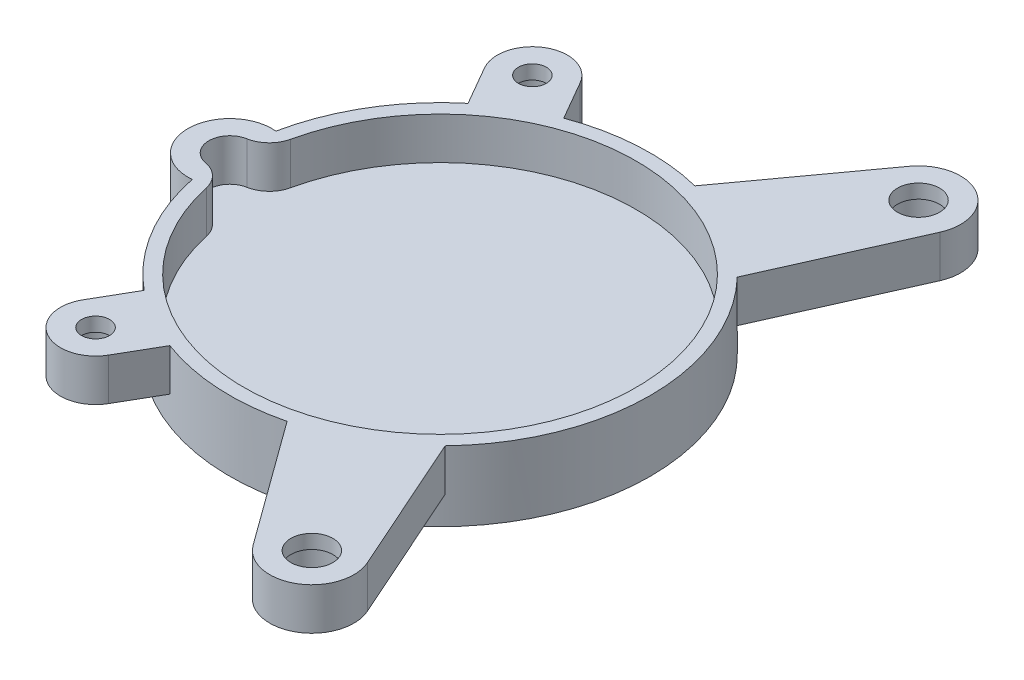
ISO-10303-21;
HEADER;
FILE_DESCRIPTION(('STEP AP214'),'2;1');
FILE_NAME('part.step','',(''),(''),'','','');
FILE_SCHEMA(('AUTOMOTIVE_DESIGN { 1 0 10303 214 1 1 1 1 }'));
ENDSEC;
DATA;
#1=APPLICATION_CONTEXT('core data for automotive mechanical design processes');
#2=APPLICATION_PROTOCOL_DEFINITION('international standard','automotive_design',2000,#1);
#3=PRODUCT_CONTEXT('',#1,'mechanical');
#4=PRODUCT('Part','Part','',(#3));
#5=PRODUCT_RELATED_PRODUCT_CATEGORY('part','',(#4));
#6=PRODUCT_DEFINITION_FORMATION('','',#4);
#7=PRODUCT_DEFINITION_CONTEXT('part definition',#1,'design');
#8=PRODUCT_DEFINITION('design','',#6,#7);
#9=PRODUCT_DEFINITION_SHAPE('','',#8);
#10=(LENGTH_UNIT() NAMED_UNIT(*) SI_UNIT(.MILLI.,.METRE.));
#11=(NAMED_UNIT(*) PLANE_ANGLE_UNIT() SI_UNIT($,.RADIAN.));
#12=(NAMED_UNIT(*) SI_UNIT($,.STERADIAN.) SOLID_ANGLE_UNIT());
#13=UNCERTAINTY_MEASURE_WITH_UNIT(LENGTH_MEASURE(1.E-05),#10,'distance_accuracy_value','');
#14=(GEOMETRIC_REPRESENTATION_CONTEXT(3) GLOBAL_UNCERTAINTY_ASSIGNED_CONTEXT((#13)) GLOBAL_UNIT_ASSIGNED_CONTEXT((#10,
#11,#12)) REPRESENTATION_CONTEXT('',''));
#15=CARTESIAN_POINT('',(0.,0.,0.));
#16=DIRECTION('',(0.,0.,1.));
#17=DIRECTION('',(1.,0.,0.));
#18=AXIS2_PLACEMENT_3D('',#15,#16,#17);
#19=CARTESIAN_POINT('',(0.,0.,0.));
#20=DIRECTION('',(0.,1.,0.));
#21=DIRECTION('',(0.,0.,1.));
#22=AXIS2_PLACEMENT_3D('',#19,#20,#21);
#23=PLANE('',#22);
#24=CARTESIAN_POINT('',(-9.00000000000008,0.,-15.5884572681198));
#25=DIRECTION('',(0.,1.,0.));
#26=DIRECTION('',(0.,0.,1.));
#27=AXIS2_PLACEMENT_3D('',#24,#25,#26);
#28=CIRCLE('',#27,1.);
#29=CARTESIAN_POINT('',(-9.00000000000008,0.,-14.5884572681198));
#30=VERTEX_POINT('',#29);
#31=EDGE_CURVE('E139',#30,#30,#28,.F.);
#32=ORIENTED_EDGE('',*,*,#31,.T.);
#33=EDGE_LOOP('',(#32));
#34=FACE_BOUND('',#33,.T.);
#35=CARTESIAN_POINT('',(-15.,0.,0.));
#36=DIRECTION('',(0.,1.,0.));
#37=DIRECTION('',(0.,0.,1.));
#38=AXIS2_PLACEMENT_3D('',#35,#36,#37);
#39=CIRCLE('',#38,1.5);
#40=CARTESIAN_POINT('',(-15.2678571428571,0.,-1.47589042649528));
#41=VERTEX_POINT('',#40);
#42=CARTESIAN_POINT('',(-15.2678571428571,0.,1.47589042649528));
#43=VERTEX_POINT('',#42);
#44=EDGE_CURVE('E11',#41,#43,#39,.T.);
#45=ORIENTED_EDGE('',*,*,#44,.F.);
#46=CARTESIAN_POINT('',(-15.625,0.,-3.44374432848898));
#47=DIRECTION('',(0.,1.,0.));
#48=DIRECTION('',(0.,0.,1.));
#49=AXIS2_PLACEMENT_3D('',#46,#47,#48);
#50=CIRCLE('',#49,2.);
#51=CARTESIAN_POINT('',(-13.671875,0.,-3.01327628742785));
#52=VERTEX_POINT('',#51);
#53=EDGE_CURVE('E45',#41,#52,#50,.T.);
#54=ORIENTED_EDGE('',*,*,#53,.T.);
#55=CARTESIAN_POINT('',(0.,0.,0.));
#56=DIRECTION('',(0.,1.,0.));
#57=DIRECTION('',(0.,0.,1.));
#58=AXIS2_PLACEMENT_3D('',#55,#56,#57);
#59=CIRCLE('',#58,14.);
#60=CARTESIAN_POINT('',(-13.671875,0.,3.01327628742786));
#61=VERTEX_POINT('',#60);
#62=EDGE_CURVE('E95',#61,#52,#59,.T.);
#63=ORIENTED_EDGE('',*,*,#62,.F.);
#64=CARTESIAN_POINT('',(-15.625,0.,3.44374432848898));
#65=DIRECTION('',(0.,1.,0.));
#66=DIRECTION('',(0.,0.,1.));
#67=AXIS2_PLACEMENT_3D('',#64,#65,#66);
#68=CIRCLE('',#67,2.);
#69=EDGE_CURVE('E51',#43,#61,#68,.F.);
#70=ORIENTED_EDGE('',*,*,#69,.F.);
#71=EDGE_LOOP('',(#45,#54,#63,#70));
#72=FACE_BOUND('',#71,.T.);
#73=CARTESIAN_POINT('',(-15.,0.,0.));
#74=DIRECTION('',(0.,1.,0.));
#75=DIRECTION('',(0.,0.,1.));
#76=AXIS2_PLACEMENT_3D('',#73,#74,#75);
#77=CIRCLE('',#76,3.);
#78=CARTESIAN_POINT('',(-14.7,0.,2.98496231131986));
#79=VERTEX_POINT('',#78);
#80=CARTESIAN_POINT('',(-14.7,0.,-2.98496231131986));
#81=VERTEX_POINT('',#80);
#82=EDGE_CURVE('E125',#79,#81,#77,.F.);
#83=ORIENTED_EDGE('',*,*,#82,.F.);
#84=CARTESIAN_POINT('',(0.,0.,0.));
#85=DIRECTION('',(0.,1.,0.));
#86=DIRECTION('',(0.,0.,1.));
#87=AXIS2_PLACEMENT_3D('',#84,#85,#86);
#88=CIRCLE('',#87,15.);
#89=CARTESIAN_POINT('',(-9.56016323833567,0.,11.5586884574495));
#90=VERTEX_POINT('',#89);
#91=EDGE_CURVE('E129',#90,#79,#88,.F.);
#92=ORIENTED_EDGE('',*,*,#91,.F.);
#93=DIRECTION('',(-0.500000000000004,0.,0.866025403784436));
#94=VECTOR('',#93,1.);
#95=CARTESIAN_POINT('',(-2.16506350946109,0.,-1.25000000000001));
#96=LINE('',#95,#94);
#97=CARTESIAN_POINT('',(-11.1650635094612,0.,14.3384572681198));
#98=VERTEX_POINT('',#97);
#99=EDGE_CURVE('E151',#90,#98,#96,.T.);
#100=ORIENTED_EDGE('',*,*,#99,.T.);
#101=CARTESIAN_POINT('',(-9.00000000000008,0.,15.5884572681198));
#102=DIRECTION('',(0.,1.,0.));
#103=DIRECTION('',(0.,0.,1.));
#104=AXIS2_PLACEMENT_3D('',#101,#102,#103);
#105=CIRCLE('',#104,2.5);
#106=CARTESIAN_POINT('',(-6.83493649053898,0.,16.8384572681199));
#107=VERTEX_POINT('',#106);
#108=EDGE_CURVE('E154',#98,#107,#105,.T.);
#109=ORIENTED_EDGE('',*,*,#108,.T.);
#110=DIRECTION('',(-0.500000000000004,0.,0.866025403784436));
#111=VECTOR('',#110,1.);
#112=CARTESIAN_POINT('',(2.16506350946109,0.,1.25000000000001));
#113=LINE('',#112,#111);
#114=CARTESIAN_POINT('',(-5.23003621941349,0.,14.0586884574495));
#115=VERTEX_POINT('',#114);
#116=EDGE_CURVE('E110',#115,#107,#113,.T.);
#117=ORIENTED_EDGE('',*,*,#116,.F.);
#118=CARTESIAN_POINT('',(3.63498864822928,0.,14.5528985953742));
#119=VERTEX_POINT('',#118);
#120=EDGE_CURVE('E128',#119,#115,#88,.F.);
#121=ORIENTED_EDGE('',*,*,#120,.F.);
#122=DIRECTION('',(0.587785252292465,0.,0.809016994374953));
#123=VECTOR('',#122,1.);
#124=CARTESIAN_POINT('',(-4.54118356261046,0.,3.29936298571533));
#125=LINE('',#124,#123);
#126=CARTESIAN_POINT('',(10.0729490168751,0.,23.4139908514884));
#127=VERTEX_POINT('',#126);
#128=EDGE_CURVE('E160',#119,#127,#125,.T.);
#129=ORIENTED_EDGE('',*,*,#128,.T.);
#130=CARTESIAN_POINT('',(12.4999999999999,0.,21.650635094611));
#131=DIRECTION('',(0.,1.,0.));
#132=DIRECTION('',(0.,0.,1.));
#133=AXIS2_PLACEMENT_3D('',#130,#131,#132);
#134=CIRCLE('',#133,3.);
#135=CARTESIAN_POINT('',(15.2406363729277,0.,20.4304251653836));
#136=VERTEX_POINT('',#135);
#137=EDGE_CURVE('E157',#127,#136,#134,.T.);
#138=ORIENTED_EDGE('',*,*,#137,.T.);
#139=DIRECTION('',(0.406736643075804,0.,0.913545457642599));
#140=VECTOR('',#139,1.);
#141=CARTESIAN_POINT('',(5.12792394324079,0.,-2.28309883561129));
#142=LINE('',#141,#140);
#143=CARTESIAN_POINT('',(10.7856855581782,0.,10.4244418095218));
#144=VERTEX_POINT('',#143);
#145=EDGE_CURVE('E106',#144,#136,#142,.T.);
#146=ORIENTED_EDGE('',*,*,#145,.F.);
#147=CARTESIAN_POINT('',(10.7856855581782,0.,-10.4244418095218));
#148=VERTEX_POINT('',#147);
#149=EDGE_CURVE('E841',#148,#144,#88,.F.);
#150=ORIENTED_EDGE('',*,*,#149,.F.);
#151=DIRECTION('',(0.406736643075804,0.,-0.913545457642599));
#152=VECTOR('',#151,1.);
#153=CARTESIAN_POINT('',(5.12792394324079,0.,2.28309883561129));
#154=LINE('',#153,#152);
#155=CARTESIAN_POINT('',(15.2406363729277,0.,-20.4304251653836));
#156=VERTEX_POINT('',#155);
#157=EDGE_CURVE('E148',#148,#156,#154,.T.);
#158=ORIENTED_EDGE('',*,*,#157,.T.);
#159=CARTESIAN_POINT('',(12.4999999999999,0.,-21.650635094611));
#160=DIRECTION('',(0.,1.,0.));
#161=DIRECTION('',(0.,0.,1.));
#162=AXIS2_PLACEMENT_3D('',#159,#160,#161);
#163=CIRCLE('',#162,3.);
#164=CARTESIAN_POINT('',(10.0729490168751,0.,-23.4139908514884));
#165=VERTEX_POINT('',#164);
#166=EDGE_CURVE('E116',#165,#156,#163,.F.);
#167=ORIENTED_EDGE('',*,*,#166,.F.);
#168=DIRECTION('',(0.587785252292465,0.,-0.809016994374953));
#169=VECTOR('',#168,1.);
#170=CARTESIAN_POINT('',(-4.54118356261046,0.,-3.29936298571533));
#171=LINE('',#170,#169);
#172=CARTESIAN_POINT('',(3.63498864822928,0.,-14.5528985953742));
#173=VERTEX_POINT('',#172);
#174=EDGE_CURVE('E113',#173,#165,#171,.T.);
#175=ORIENTED_EDGE('',*,*,#174,.F.);
#176=CARTESIAN_POINT('',(-5.23003621941349,0.,-14.0586884574495));
#177=VERTEX_POINT('',#176);
#178=EDGE_CURVE('E839',#177,#173,#88,.F.);
#179=ORIENTED_EDGE('',*,*,#178,.F.);
#180=DIRECTION('',(-0.500000000000004,0.,-0.866025403784436));
#181=VECTOR('',#180,1.);
#182=CARTESIAN_POINT('',(2.16506350946109,0.,-1.25000000000001));
#183=LINE('',#182,#181);
#184=CARTESIAN_POINT('',(-6.83493649053898,0.,-16.8384572681199));
#185=VERTEX_POINT('',#184);
#186=EDGE_CURVE('E145',#177,#185,#183,.T.);
#187=ORIENTED_EDGE('',*,*,#186,.T.);
#188=CARTESIAN_POINT('',(-9.00000000000008,0.,-15.5884572681198));
#189=DIRECTION('',(0.,1.,0.));
#190=DIRECTION('',(0.,0.,1.));
#191=AXIS2_PLACEMENT_3D('',#188,#189,#190);
#192=CIRCLE('',#191,2.5);
#193=CARTESIAN_POINT('',(-11.1650635094612,0.,-14.3384572681198));
#194=VERTEX_POINT('',#193);
#195=EDGE_CURVE('E119',#194,#185,#192,.F.);
#196=ORIENTED_EDGE('',*,*,#195,.F.);
#197=DIRECTION('',(-0.500000000000004,0.,-0.866025403784436));
#198=VECTOR('',#197,1.);
#199=CARTESIAN_POINT('',(-2.16506350946109,0.,1.25000000000001));
#200=LINE('',#199,#198);
#201=CARTESIAN_POINT('',(-9.56016323833567,0.,-11.5586884574495));
#202=VERTEX_POINT('',#201);
#203=EDGE_CURVE('E122',#202,#194,#200,.T.);
#204=ORIENTED_EDGE('',*,*,#203,.F.);
#205=EDGE_CURVE('E132',#81,#202,#88,.F.);
#206=ORIENTED_EDGE('',*,*,#205,.F.);
#207=EDGE_LOOP('',(#83,#92,#100,#109,#117,#121,#129,#138,#146,#150,#158,#167,#175,#179,#187,
#196,#204,#206));
#208=FACE_BOUND('',#207,.T.);
#209=CARTESIAN_POINT('',(12.4999999999999,0.,-21.650635094611));
#210=DIRECTION('',(0.,1.,0.));
#211=DIRECTION('',(0.,0.,1.));
#212=AXIS2_PLACEMENT_3D('',#209,#210,#211);
#213=CIRCLE('',#212,1.5);
#214=CARTESIAN_POINT('',(12.4999999999999,0.,-20.150635094611));
#215=VERTEX_POINT('',#214);
#216=EDGE_CURVE('E142',#215,#215,#213,.F.);
#217=ORIENTED_EDGE('',*,*,#216,.T.);
#218=EDGE_LOOP('',(#217));
#219=FACE_BOUND('',#218,.T.);
#220=CARTESIAN_POINT('',(12.4999999999999,0.,21.650635094611));
#221=DIRECTION('',(0.,1.,0.));
#222=DIRECTION('',(0.,0.,1.));
#223=AXIS2_PLACEMENT_3D('',#220,#221,#222);
#224=CIRCLE('',#223,1.5);
#225=CARTESIAN_POINT('',(12.4999999999999,0.,23.150635094611));
#226=VERTEX_POINT('',#225);
#227=EDGE_CURVE('E133',#226,#226,#224,.T.);
#228=ORIENTED_EDGE('',*,*,#227,.F.);
#229=EDGE_LOOP('',(#228));
#230=FACE_BOUND('',#229,.T.);
#231=CARTESIAN_POINT('',(-9.00000000000008,0.,15.5884572681198));
#232=DIRECTION('',(0.,1.,0.));
#233=DIRECTION('',(0.,0.,1.));
#234=AXIS2_PLACEMENT_3D('',#231,#232,#233);
#235=CIRCLE('',#234,1.);
#236=CARTESIAN_POINT('',(-9.00000000000008,0.,16.5884572681198));
#237=VERTEX_POINT('',#236);
#238=EDGE_CURVE('E136',#237,#237,#235,.T.);
#239=ORIENTED_EDGE('',*,*,#238,.F.);
#240=EDGE_LOOP('',(#239));
#241=FACE_BOUND('',#240,.T.);
#242=ADVANCED_FACE('F41',(#34,#72,#208,#219,#230,#241),#23,.T.);
#243=CARTESIAN_POINT('',(0.,-3.,0.));
#244=DIRECTION('',(0.,1.,0.));
#245=DIRECTION('',(0.,0.,1.));
#246=AXIS2_PLACEMENT_3D('',#243,#244,#245);
#247=CYLINDRICAL_SURFACE('',#246,14.);
#248=ORIENTED_EDGE('',*,*,#62,.T.);
#249=DIRECTION('',(0.,1.,0.));
#250=VECTOR('',#249,1.);
#251=CARTESIAN_POINT('',(-13.671875,-3.,-3.01327628742785));
#252=LINE('',#251,#250);
#253=CARTESIAN_POINT('',(-13.671875,-3.,-3.01327628742785));
#254=VERTEX_POINT('',#253);
#255=EDGE_CURVE('E251',#254,#52,#252,.T.);
#256=ORIENTED_EDGE('',*,*,#255,.F.);
#257=CARTESIAN_POINT('',(0.,-3.,0.));
#258=DIRECTION('',(0.,1.,0.));
#259=DIRECTION('',(0.,0.,1.));
#260=AXIS2_PLACEMENT_3D('',#257,#258,#259);
#261=CIRCLE('',#260,14.);
#262=CARTESIAN_POINT('',(-13.671875,-3.,3.01327628742786));
#263=VERTEX_POINT('',#262);
#264=EDGE_CURVE('E86',#263,#254,#261,.T.);
#265=ORIENTED_EDGE('',*,*,#264,.F.);
#266=DIRECTION('',(0.,1.,0.));
#267=VECTOR('',#266,1.);
#268=CARTESIAN_POINT('',(-13.671875,-3.,3.01327628742786));
#269=LINE('',#268,#267);
#270=EDGE_CURVE('E257',#263,#61,#269,.T.);
#271=ORIENTED_EDGE('',*,*,#270,.T.);
#272=EDGE_LOOP('',(#248,#256,#265,#271));
#273=FACE_BOUND('',#272,.T.);
#274=ADVANCED_FACE('F265',(#273),#247,.F.);
#275=CARTESIAN_POINT('',(-15.625,-3.,-3.44374432848898));
#276=DIRECTION('',(0.,1.,0.));
#277=DIRECTION('',(0.,0.,1.));
#278=AXIS2_PLACEMENT_3D('',#275,#276,#277);
#279=CYLINDRICAL_SURFACE('',#278,2.);
#280=ORIENTED_EDGE('',*,*,#53,.F.);
#281=DIRECTION('',(0.,1.,0.));
#282=VECTOR('',#281,1.);
#283=CARTESIAN_POINT('',(-15.2678571428571,-3.,-1.47589042649528));
#284=LINE('',#283,#282);
#285=CARTESIAN_POINT('',(-15.2678571428571,-3.,-1.47589042649528));
#286=VERTEX_POINT('',#285);
#287=EDGE_CURVE('E78',#286,#41,#284,.T.);
#288=ORIENTED_EDGE('',*,*,#287,.F.);
#289=CARTESIAN_POINT('',(-15.625,-3.,-3.44374432848898));
#290=DIRECTION('',(0.,1.,0.));
#291=DIRECTION('',(0.,0.,1.));
#292=AXIS2_PLACEMENT_3D('',#289,#290,#291);
#293=CIRCLE('',#292,2.);
#294=EDGE_CURVE('E82',#286,#254,#293,.T.);
#295=ORIENTED_EDGE('',*,*,#294,.T.);
#296=ORIENTED_EDGE('',*,*,#255,.T.);
#297=EDGE_LOOP('',(#280,#288,#295,#296));
#298=FACE_BOUND('',#297,.T.);
#299=ADVANCED_FACE('F80',(#298),#279,.T.);
#300=CARTESIAN_POINT('',(0.,-3.,0.));
#301=DIRECTION('',(0.,1.,0.));
#302=DIRECTION('',(0.,0.,1.));
#303=AXIS2_PLACEMENT_3D('',#300,#301,#302);
#304=PLANE('',#303);
#305=ORIENTED_EDGE('',*,*,#294,.F.);
#306=CARTESIAN_POINT('',(-15.,-3.,0.));
#307=DIRECTION('',(0.,1.,0.));
#308=DIRECTION('',(0.,0.,1.));
#309=AXIS2_PLACEMENT_3D('',#306,#307,#308);
#310=CIRCLE('',#309,1.5);
#311=CARTESIAN_POINT('',(-15.2678571428571,-3.,1.47589042649528));
#312=VERTEX_POINT('',#311);
#313=EDGE_CURVE('E93',#286,#312,#310,.T.);
#314=ORIENTED_EDGE('',*,*,#313,.T.);
#315=CARTESIAN_POINT('',(-15.625,-3.,3.44374432848898));
#316=DIRECTION('',(0.,1.,0.));
#317=DIRECTION('',(0.,0.,1.));
#318=AXIS2_PLACEMENT_3D('',#315,#316,#317);
#319=CIRCLE('',#318,2.);
#320=EDGE_CURVE('E98',#312,#263,#319,.F.);
#321=ORIENTED_EDGE('',*,*,#320,.T.);
#322=ORIENTED_EDGE('',*,*,#264,.T.);
#323=EDGE_LOOP('',(#305,#314,#321,#322));
#324=FACE_BOUND('',#323,.T.);
#325=ADVANCED_FACE('F91',(#324),#304,.T.);
#326=CARTESIAN_POINT('',(-15.625,-3.,3.44374432848898));
#327=DIRECTION('',(0.,1.,0.));
#328=DIRECTION('',(0.,0.,1.));
#329=AXIS2_PLACEMENT_3D('',#326,#327,#328);
#330=CYLINDRICAL_SURFACE('',#329,2.);
#331=ORIENTED_EDGE('',*,*,#69,.T.);
#332=ORIENTED_EDGE('',*,*,#270,.F.);
#333=ORIENTED_EDGE('',*,*,#320,.F.);
#334=DIRECTION('',(0.,1.,0.));
#335=VECTOR('',#334,1.);
#336=CARTESIAN_POINT('',(-15.2678571428571,-3.,1.47589042649528));
#337=LINE('',#336,#335);
#338=EDGE_CURVE('E73',#312,#43,#337,.T.);
#339=ORIENTED_EDGE('',*,*,#338,.T.);
#340=EDGE_LOOP('',(#331,#332,#333,#339));
#341=FACE_BOUND('',#340,.T.);
#342=ADVANCED_FACE('F459',(#341),#330,.T.);
#343=CARTESIAN_POINT('',(-15.,-3.,0.));
#344=DIRECTION('',(0.,1.,0.));
#345=DIRECTION('',(0.,0.,1.));
#346=AXIS2_PLACEMENT_3D('',#343,#344,#345);
#347=CYLINDRICAL_SURFACE('',#346,1.5);
#348=ORIENTED_EDGE('',*,*,#44,.T.);
#349=ORIENTED_EDGE('',*,*,#338,.F.);
#350=ORIENTED_EDGE('',*,*,#313,.F.);
#351=ORIENTED_EDGE('',*,*,#287,.T.);
#352=EDGE_LOOP('',(#348,#349,#350,#351));
#353=FACE_BOUND('',#352,.T.);
#354=ADVANCED_FACE('F97',(#353),#347,.F.);
#355=CARTESIAN_POINT('',(-9.00000000000008,-3.,15.5884572681198));
#356=DIRECTION('',(0.,1.,0.));
#357=DIRECTION('',(0.,0.,1.));
#358=AXIS2_PLACEMENT_3D('',#355,#356,#357);
#359=CYLINDRICAL_SURFACE('',#358,1.);
#360=CARTESIAN_POINT('',(-9.00000000000008,-1.,15.5884572681198));
#361=DIRECTION('',(0.,-1.,0.));
#362=DIRECTION('',(0.,0.,-1.));
#363=AXIS2_PLACEMENT_3D('',#360,#361,#362);
#364=CIRCLE('',#363,1.);
#365=CARTESIAN_POINT('',(-9.00000000000008,-1.,14.5884572681198));
#366=VERTEX_POINT('',#365);
#367=EDGE_CURVE('E247',#366,#366,#364,.T.);
#368=ORIENTED_EDGE('',*,*,#367,.T.);
#369=EDGE_LOOP('',(#368));
#370=FACE_BOUND('',#369,.T.);
#371=ORIENTED_EDGE('',*,*,#238,.T.);
#372=EDGE_LOOP('',(#371));
#373=FACE_BOUND('',#372,.T.);
#374=ADVANCED_FACE('F43',(#370,#373),#359,.F.);
#375=CARTESIAN_POINT('',(12.4999999999999,-3.,21.650635094611));
#376=DIRECTION('',(0.,1.,0.));
#377=DIRECTION('',(0.,0.,1.));
#378=AXIS2_PLACEMENT_3D('',#375,#376,#377);
#379=CYLINDRICAL_SURFACE('',#378,1.5);
#380=CARTESIAN_POINT('',(12.4999999999999,-1.,21.650635094611));
#381=DIRECTION('',(0.,-1.,0.));
#382=DIRECTION('',(0.,0.,-1.));
#383=AXIS2_PLACEMENT_3D('',#380,#381,#382);
#384=CIRCLE('',#383,1.5);
#385=CARTESIAN_POINT('',(12.4999999999999,-1.,20.150635094611));
#386=VERTEX_POINT('',#385);
#387=EDGE_CURVE('E523',#386,#386,#384,.T.);
#388=ORIENTED_EDGE('',*,*,#387,.T.);
#389=EDGE_LOOP('',(#388));
#390=FACE_BOUND('',#389,.T.);
#391=ORIENTED_EDGE('',*,*,#227,.T.);
#392=EDGE_LOOP('',(#391));
#393=FACE_BOUND('',#392,.T.);
#394=ADVANCED_FACE('F466',(#390,#393),#379,.F.);
#395=CARTESIAN_POINT('',(0.,2.,0.));
#396=DIRECTION('',(0.,-1.,0.));
#397=DIRECTION('',(0.,0.,-1.));
#398=AXIS2_PLACEMENT_3D('',#395,#396,#397);
#399=CYLINDRICAL_SURFACE('',#398,15.);
#400=DIRECTION('',(0.,-1.,0.));
#401=VECTOR('',#400,1.);
#402=CARTESIAN_POINT('',(-9.56016323833567,2.,11.5586884574495));
#403=LINE('',#402,#401);
#404=CARTESIAN_POINT('',(-9.56016323833567,-3.,11.5586884574494));
#405=VERTEX_POINT('',#404);
#406=EDGE_CURVE('E201',#405,#90,#403,.F.);
#407=ORIENTED_EDGE('',*,*,#406,.T.);
#408=ORIENTED_EDGE('',*,*,#91,.T.);
#409=DIRECTION('',(0.,-1.,0.));
#410=VECTOR('',#409,1.);
#411=CARTESIAN_POINT('',(-14.7,2.,2.98496231131986));
#412=LINE('',#411,#410);
#413=CARTESIAN_POINT('',(-14.7,-5.,2.98496231131986));
#414=VERTEX_POINT('',#413);
#415=EDGE_CURVE('E178',#79,#414,#412,.T.);
#416=ORIENTED_EDGE('',*,*,#415,.T.);
#417=CARTESIAN_POINT('',(0.,-5.,0.));
#418=DIRECTION('',(0.,-1.,0.));
#419=DIRECTION('',(0.,0.,-1.));
#420=AXIS2_PLACEMENT_3D('',#417,#418,#419);
#421=CIRCLE('',#420,15.);
#422=CARTESIAN_POINT('',(-14.7,-5.,-2.98496231131986));
#423=VERTEX_POINT('',#422);
#424=EDGE_CURVE('E184',#423,#414,#421,.T.);
#425=ORIENTED_EDGE('',*,*,#424,.F.);
#426=DIRECTION('',(0.,-1.,0.));
#427=VECTOR('',#426,1.);
#428=CARTESIAN_POINT('',(-14.7,2.,-2.98496231131986));
#429=LINE('',#428,#427);
#430=EDGE_CURVE('E181',#81,#423,#429,.T.);
#431=ORIENTED_EDGE('',*,*,#430,.F.);
#432=ORIENTED_EDGE('',*,*,#205,.T.);
#433=DIRECTION('',(0.,-1.,0.));
#434=VECTOR('',#433,1.);
#435=CARTESIAN_POINT('',(-9.56016323833567,2.,-11.5586884574495));
#436=LINE('',#435,#434);
#437=CARTESIAN_POINT('',(-9.56016323833567,-3.,-11.5586884574494));
#438=VERTEX_POINT('',#437);
#439=EDGE_CURVE('E171',#438,#202,#436,.F.);
#440=ORIENTED_EDGE('',*,*,#439,.F.);
#441=CARTESIAN_POINT('',(0.,-3.,0.));
#442=DIRECTION('',(0.,1.,0.));
#443=DIRECTION('',(0.,0.,1.));
#444=AXIS2_PLACEMENT_3D('',#441,#442,#443);
#445=CIRCLE('',#444,15.);
#446=CARTESIAN_POINT('',(-5.23003621941349,-3.,-14.0586884574495));
#447=VERTEX_POINT('',#446);
#448=EDGE_CURVE('E177',#438,#447,#445,.F.);
#449=ORIENTED_EDGE('',*,*,#448,.T.);
#450=DIRECTION('',(0.,-1.,0.));
#451=VECTOR('',#450,1.);
#452=CARTESIAN_POINT('',(-5.23003621941349,2.,-14.0586884574495));
#453=LINE('',#452,#451);
#454=EDGE_CURVE('E174',#447,#177,#453,.F.);
#455=ORIENTED_EDGE('',*,*,#454,.T.);
#456=ORIENTED_EDGE('',*,*,#178,.T.);
#457=DIRECTION('',(0.,-1.,0.));
#458=VECTOR('',#457,1.);
#459=CARTESIAN_POINT('',(3.63498864822928,2.,-14.5528985953742));
#460=LINE('',#459,#458);
#461=CARTESIAN_POINT('',(3.63498864822928,-3.,-14.5528985953742));
#462=VERTEX_POINT('',#461);
#463=EDGE_CURVE('E166',#462,#173,#460,.F.);
#464=ORIENTED_EDGE('',*,*,#463,.F.);
#465=CARTESIAN_POINT('',(0.,-3.,0.));
#466=DIRECTION('',(0.,1.,0.));
#467=DIRECTION('',(0.,0.,1.));
#468=AXIS2_PLACEMENT_3D('',#465,#466,#467);
#469=CIRCLE('',#468,15.);
#470=CARTESIAN_POINT('',(10.7856855581782,-3.,-10.4244418095218));
#471=VERTEX_POINT('',#470);
#472=EDGE_CURVE('E170',#462,#471,#469,.F.);
#473=ORIENTED_EDGE('',*,*,#472,.T.);
#474=DIRECTION('',(0.,-1.,0.));
#475=VECTOR('',#474,1.);
#476=CARTESIAN_POINT('',(10.7856855581782,2.,-10.4244418095218));
#477=LINE('',#476,#475);
#478=EDGE_CURVE('E163',#471,#148,#477,.F.);
#479=ORIENTED_EDGE('',*,*,#478,.T.);
#480=ORIENTED_EDGE('',*,*,#149,.T.);
#481=DIRECTION('',(0.,-1.,0.));
#482=VECTOR('',#481,1.);
#483=CARTESIAN_POINT('',(10.7856855581782,2.,10.4244418095218));
#484=LINE('',#483,#482);
#485=CARTESIAN_POINT('',(10.7856855581782,-3.,10.4244418095218));
#486=VERTEX_POINT('',#485);
#487=EDGE_CURVE('E218',#486,#144,#484,.F.);
#488=ORIENTED_EDGE('',*,*,#487,.F.);
#489=CARTESIAN_POINT('',(0.,-3.,0.));
#490=DIRECTION('',(0.,1.,0.));
#491=DIRECTION('',(0.,0.,1.));
#492=AXIS2_PLACEMENT_3D('',#489,#490,#491);
#493=CIRCLE('',#492,15.);
#494=CARTESIAN_POINT('',(3.63498864822928,-3.,14.5528985953742));
#495=VERTEX_POINT('',#494);
#496=EDGE_CURVE('E109',#486,#495,#493,.F.);
#497=ORIENTED_EDGE('',*,*,#496,.T.);
#498=DIRECTION('',(0.,-1.,0.));
#499=VECTOR('',#498,1.);
#500=CARTESIAN_POINT('',(3.63498864822928,2.,14.5528985953742));
#501=LINE('',#500,#499);
#502=EDGE_CURVE('E215',#495,#119,#501,.F.);
#503=ORIENTED_EDGE('',*,*,#502,.T.);
#504=ORIENTED_EDGE('',*,*,#120,.T.);
#505=DIRECTION('',(0.,-1.,0.));
#506=VECTOR('',#505,1.);
#507=CARTESIAN_POINT('',(-5.23003621941349,2.,14.0586884574495));
#508=LINE('',#507,#506);
#509=CARTESIAN_POINT('',(-5.23003621941349,-3.,14.0586884574495));
#510=VERTEX_POINT('',#509);
#511=EDGE_CURVE('E204',#510,#115,#508,.F.);
#512=ORIENTED_EDGE('',*,*,#511,.F.);
#513=CARTESIAN_POINT('',(0.,-3.,0.));
#514=DIRECTION('',(0.,1.,0.));
#515=DIRECTION('',(0.,0.,1.));
#516=AXIS2_PLACEMENT_3D('',#513,#514,#515);
#517=CIRCLE('',#516,15.);
#518=EDGE_CURVE('E167',#510,#405,#517,.F.);
#519=ORIENTED_EDGE('',*,*,#518,.T.);
#520=EDGE_LOOP('',(#407,#408,#416,#425,#431,#432,#440,#449,#455,#456,#464,#473,#479,#480,#488,
#497,#503,#504,#512,#519));
#521=FACE_BOUND('',#520,.T.);
#522=ADVANCED_FACE('F422',(#521),#399,.T.);
#523=CARTESIAN_POINT('',(-9.00000000000008,-3.,-15.5884572681198));
#524=DIRECTION('',(0.,1.,0.));
#525=DIRECTION('',(0.,0.,1.));
#526=AXIS2_PLACEMENT_3D('',#523,#524,#525);
#527=CYLINDRICAL_SURFACE('',#526,1.);
#528=CARTESIAN_POINT('',(-9.00000000000008,-1.,-15.5884572681198));
#529=DIRECTION('',(0.,-1.,0.));
#530=DIRECTION('',(0.,0.,-1.));
#531=AXIS2_PLACEMENT_3D('',#528,#529,#530);
#532=CIRCLE('',#531,1.);
#533=CARTESIAN_POINT('',(-9.00000000000008,-1.,-16.5884572681198));
#534=VERTEX_POINT('',#533);
#535=EDGE_CURVE('E369',#534,#534,#532,.F.);
#536=ORIENTED_EDGE('',*,*,#535,.F.);
#537=EDGE_LOOP('',(#536));
#538=FACE_BOUND('',#537,.T.);
#539=ORIENTED_EDGE('',*,*,#31,.F.);
#540=EDGE_LOOP('',(#539));
#541=FACE_BOUND('',#540,.T.);
#542=ADVANCED_FACE('F465',(#538,#541),#527,.F.);
#543=CARTESIAN_POINT('',(12.4999999999999,-3.,-21.650635094611));
#544=DIRECTION('',(0.,1.,0.));
#545=DIRECTION('',(0.,0.,1.));
#546=AXIS2_PLACEMENT_3D('',#543,#544,#545);
#547=CYLINDRICAL_SURFACE('',#546,1.5);
#548=CARTESIAN_POINT('',(12.4999999999999,-1.,-21.650635094611));
#549=DIRECTION('',(0.,-1.,0.));
#550=DIRECTION('',(0.,0.,-1.));
#551=AXIS2_PLACEMENT_3D('',#548,#549,#550);
#552=CIRCLE('',#551,1.5);
#553=CARTESIAN_POINT('',(12.4999999999999,-1.,-23.150635094611));
#554=VERTEX_POINT('',#553);
#555=EDGE_CURVE('E376',#554,#554,#552,.F.);
#556=ORIENTED_EDGE('',*,*,#555,.F.);
#557=EDGE_LOOP('',(#556));
#558=FACE_BOUND('',#557,.T.);
#559=ORIENTED_EDGE('',*,*,#216,.F.);
#560=EDGE_LOOP('',(#559));
#561=FACE_BOUND('',#560,.T.);
#562=ADVANCED_FACE('F508',(#558,#561),#547,.F.);
#563=CARTESIAN_POINT('',(-15.,2.,0.));
#564=DIRECTION('',(0.,-1.,0.));
#565=DIRECTION('',(0.,0.,-1.));
#566=AXIS2_PLACEMENT_3D('',#563,#564,#565);
#567=CYLINDRICAL_SURFACE('',#566,3.);
#568=ORIENTED_EDGE('',*,*,#415,.F.);
#569=ORIENTED_EDGE('',*,*,#82,.T.);
#570=ORIENTED_EDGE('',*,*,#430,.T.);
#571=CARTESIAN_POINT('',(-15.,-5.,0.));
#572=DIRECTION('',(0.,-1.,0.));
#573=DIRECTION('',(0.,0.,-1.));
#574=AXIS2_PLACEMENT_3D('',#571,#572,#573);
#575=CIRCLE('',#574,3.);
#576=EDGE_CURVE('E189',#414,#423,#575,.T.);
#577=ORIENTED_EDGE('',*,*,#576,.F.);
#578=EDGE_LOOP('',(#568,#569,#570,#577));
#579=FACE_BOUND('',#578,.T.);
#580=ADVANCED_FACE('F430',(#579),#567,.T.);
#581=CARTESIAN_POINT('',(-2.16506350946109,-3.,1.25000000000001));
#582=DIRECTION('',(-0.866025403784436,0.,0.500000000000004));
#583=DIRECTION('',(0.500000000000004,0.,0.866025403784436));
#584=AXIS2_PLACEMENT_3D('',#581,#582,#583);
#585=PLANE('',#584);
#586=ORIENTED_EDGE('',*,*,#439,.T.);
#587=ORIENTED_EDGE('',*,*,#203,.T.);
#588=DIRECTION('',(0.,1.,0.));
#589=VECTOR('',#588,1.);
#590=CARTESIAN_POINT('',(-11.1650635094612,-3.,-14.3384572681198));
#591=LINE('',#590,#589);
#592=CARTESIAN_POINT('',(-11.1650635094612,-3.,-14.3384572681198));
#593=VERTEX_POINT('',#592);
#594=EDGE_CURVE('E185',#593,#194,#591,.T.);
#595=ORIENTED_EDGE('',*,*,#594,.F.);
#596=DIRECTION('',(0.500000000000004,0.,0.866025403784436));
#597=VECTOR('',#596,1.);
#598=CARTESIAN_POINT('',(-2.16506350946109,-3.,1.25000000000001));
#599=LINE('',#598,#597);
#600=EDGE_CURVE('E197',#593,#438,#599,.T.);
#601=ORIENTED_EDGE('',*,*,#600,.T.);
#602=EDGE_LOOP('',(#586,#587,#595,#601));
#603=FACE_BOUND('',#602,.T.);
#604=ADVANCED_FACE('F467',(#603),#585,.T.);
#605=CARTESIAN_POINT('',(-9.00000000000008,-3.,-15.5884572681198));
#606=DIRECTION('',(0.,1.,0.));
#607=DIRECTION('',(0.,0.,1.));
#608=AXIS2_PLACEMENT_3D('',#605,#606,#607);
#609=CYLINDRICAL_SURFACE('',#608,2.5);
#610=ORIENTED_EDGE('',*,*,#594,.T.);
#611=ORIENTED_EDGE('',*,*,#195,.T.);
#612=DIRECTION('',(0.,1.,0.));
#613=VECTOR('',#612,1.);
#614=CARTESIAN_POINT('',(-6.83493649053898,-3.,-16.8384572681199));
#615=LINE('',#614,#613);
#616=CARTESIAN_POINT('',(-6.83493649053898,-3.,-16.8384572681199));
#617=VERTEX_POINT('',#616);
#618=EDGE_CURVE('E188',#617,#185,#615,.T.);
#619=ORIENTED_EDGE('',*,*,#618,.F.);
#620=CARTESIAN_POINT('',(-9.00000000000008,-3.,-15.5884572681198));
#621=DIRECTION('',(0.,1.,0.));
#622=DIRECTION('',(0.,0.,1.));
#623=AXIS2_PLACEMENT_3D('',#620,#621,#622);
#624=CIRCLE('',#623,2.5);
#625=EDGE_CURVE('E192',#617,#593,#624,.T.);
#626=ORIENTED_EDGE('',*,*,#625,.T.);
#627=EDGE_LOOP('',(#610,#611,#619,#626));
#628=FACE_BOUND('',#627,.T.);
#629=ADVANCED_FACE('F470',(#628),#609,.T.);
#630=CARTESIAN_POINT('',(2.16506350946109,-3.,-1.25000000000001));
#631=DIRECTION('',(-0.866025403784436,0.,0.500000000000004));
#632=DIRECTION('',(0.500000000000004,0.,0.866025403784436));
#633=AXIS2_PLACEMENT_3D('',#630,#631,#632);
#634=PLANE('',#633);
#635=ORIENTED_EDGE('',*,*,#186,.F.);
#636=ORIENTED_EDGE('',*,*,#454,.F.);
#637=DIRECTION('',(0.500000000000004,0.,0.866025403784436));
#638=VECTOR('',#637,1.);
#639=CARTESIAN_POINT('',(2.16506350946109,-3.,-1.25000000000001));
#640=LINE('',#639,#638);
#641=EDGE_CURVE('E391',#617,#447,#640,.T.);
#642=ORIENTED_EDGE('',*,*,#641,.F.);
#643=ORIENTED_EDGE('',*,*,#618,.T.);
#644=EDGE_LOOP('',(#635,#636,#642,#643));
#645=FACE_BOUND('',#644,.T.);
#646=ADVANCED_FACE('F474',(#645),#634,.F.);
#647=CARTESIAN_POINT('',(12.4999999999999,-3.,-21.650635094611));
#648=DIRECTION('',(0.,1.,0.));
#649=DIRECTION('',(0.,0.,1.));
#650=AXIS2_PLACEMENT_3D('',#647,#648,#649);
#651=CYLINDRICAL_SURFACE('',#650,3.);
#652=DIRECTION('',(0.,1.,0.));
#653=VECTOR('',#652,1.);
#654=CARTESIAN_POINT('',(10.0729490168751,-3.,-23.4139908514884));
#655=LINE('',#654,#653);
#656=CARTESIAN_POINT('',(10.0729490168751,-3.,-23.4139908514884));
#657=VERTEX_POINT('',#656);
#658=EDGE_CURVE('E196',#657,#165,#655,.T.);
#659=ORIENTED_EDGE('',*,*,#658,.T.);
#660=ORIENTED_EDGE('',*,*,#166,.T.);
#661=DIRECTION('',(0.,1.,0.));
#662=VECTOR('',#661,1.);
#663=CARTESIAN_POINT('',(15.2406363729277,-3.,-20.4304251653836));
#664=LINE('',#663,#662);
#665=CARTESIAN_POINT('',(15.2406363729277,-3.,-20.4304251653836));
#666=VERTEX_POINT('',#665);
#667=EDGE_CURVE('E193',#666,#156,#664,.T.);
#668=ORIENTED_EDGE('',*,*,#667,.F.);
#669=CARTESIAN_POINT('',(12.4999999999999,-3.,-21.650635094611));
#670=DIRECTION('',(0.,1.,0.));
#671=DIRECTION('',(0.,0.,1.));
#672=AXIS2_PLACEMENT_3D('',#669,#670,#671);
#673=CIRCLE('',#672,3.);
#674=EDGE_CURVE('E373',#666,#657,#673,.T.);
#675=ORIENTED_EDGE('',*,*,#674,.T.);
#676=EDGE_LOOP('',(#659,#660,#668,#675));
#677=FACE_BOUND('',#676,.T.);
#678=ADVANCED_FACE('F476',(#677),#651,.T.);
#679=CARTESIAN_POINT('',(5.12792394324079,-3.,2.28309883561129));
#680=DIRECTION('',(-0.913545457642599,0.,-0.406736643075804));
#681=DIRECTION('',(-0.406736643075804,0.,0.913545457642599));
#682=AXIS2_PLACEMENT_3D('',#679,#680,#681);
#683=PLANE('',#682);
#684=ORIENTED_EDGE('',*,*,#157,.F.);
#685=ORIENTED_EDGE('',*,*,#478,.F.);
#686=DIRECTION('',(-0.406736643075804,0.,0.913545457642599));
#687=VECTOR('',#686,1.);
#688=CARTESIAN_POINT('',(5.12792394324079,-3.,2.28309883561129));
#689=LINE('',#688,#687);
#690=EDGE_CURVE('E200',#666,#471,#689,.T.);
#691=ORIENTED_EDGE('',*,*,#690,.F.);
#692=ORIENTED_EDGE('',*,*,#667,.T.);
#693=EDGE_LOOP('',(#684,#685,#691,#692));
#694=FACE_BOUND('',#693,.T.);
#695=ADVANCED_FACE('F479',(#694),#683,.F.);
#696=CARTESIAN_POINT('',(-4.54118356261046,-3.,-3.29936298571533));
#697=DIRECTION('',(-0.809016994374953,0.,-0.587785252292465));
#698=DIRECTION('',(-0.587785252292465,0.,0.809016994374953));
#699=AXIS2_PLACEMENT_3D('',#696,#697,#698);
#700=PLANE('',#699);
#701=ORIENTED_EDGE('',*,*,#463,.T.);
#702=ORIENTED_EDGE('',*,*,#174,.T.);
#703=ORIENTED_EDGE('',*,*,#658,.F.);
#704=DIRECTION('',(-0.587785252292465,0.,0.809016994374953));
#705=VECTOR('',#704,1.);
#706=CARTESIAN_POINT('',(-4.54118356261046,-3.,-3.29936298571533));
#707=LINE('',#706,#705);
#708=EDGE_CURVE('E398',#657,#462,#707,.T.);
#709=ORIENTED_EDGE('',*,*,#708,.T.);
#710=EDGE_LOOP('',(#701,#702,#703,#709));
#711=FACE_BOUND('',#710,.T.);
#712=ADVANCED_FACE('F493',(#711),#700,.T.);
#713=CARTESIAN_POINT('',(-2.16506350946109,-3.,-1.25000000000001));
#714=DIRECTION('',(0.866025403784436,0.,0.500000000000004));
#715=DIRECTION('',(0.500000000000004,0.,-0.866025403784436));
#716=AXIS2_PLACEMENT_3D('',#713,#714,#715);
#717=PLANE('',#716);
#718=ORIENTED_EDGE('',*,*,#99,.F.);
#719=ORIENTED_EDGE('',*,*,#406,.F.);
#720=DIRECTION('',(0.500000000000004,0.,-0.866025403784436));
#721=VECTOR('',#720,1.);
#722=CARTESIAN_POINT('',(-2.16506350946109,-3.,-1.25000000000001));
#723=LINE('',#722,#721);
#724=CARTESIAN_POINT('',(-11.1650635094612,-3.,14.3384572681198));
#725=VERTEX_POINT('',#724);
#726=EDGE_CURVE('E219',#725,#405,#723,.T.);
#727=ORIENTED_EDGE('',*,*,#726,.F.);
#728=DIRECTION('',(0.,1.,0.));
#729=VECTOR('',#728,1.);
#730=CARTESIAN_POINT('',(-11.1650635094612,-3.,14.3384572681198));
#731=LINE('',#730,#729);
#732=EDGE_CURVE('E211',#725,#98,#731,.T.);
#733=ORIENTED_EDGE('',*,*,#732,.T.);
#734=EDGE_LOOP('',(#718,#719,#727,#733));
#735=FACE_BOUND('',#734,.T.);
#736=ADVANCED_FACE('F420',(#735),#717,.F.);
#737=CARTESIAN_POINT('',(2.16506350946109,-3.,1.25000000000001));
#738=DIRECTION('',(0.866025403784436,0.,0.500000000000004));
#739=DIRECTION('',(0.500000000000004,0.,-0.866025403784436));
#740=AXIS2_PLACEMENT_3D('',#737,#738,#739);
#741=PLANE('',#740);
#742=ORIENTED_EDGE('',*,*,#511,.T.);
#743=ORIENTED_EDGE('',*,*,#116,.T.);
#744=DIRECTION('',(0.,1.,0.));
#745=VECTOR('',#744,1.);
#746=CARTESIAN_POINT('',(-6.83493649053898,-3.,16.8384572681199));
#747=LINE('',#746,#745);
#748=CARTESIAN_POINT('',(-6.83493649053898,-3.,16.8384572681199));
#749=VERTEX_POINT('',#748);
#750=EDGE_CURVE('E208',#749,#107,#747,.T.);
#751=ORIENTED_EDGE('',*,*,#750,.F.);
#752=DIRECTION('',(0.500000000000004,0.,-0.866025403784436));
#753=VECTOR('',#752,1.);
#754=CARTESIAN_POINT('',(2.16506350946109,-3.,1.25000000000001));
#755=LINE('',#754,#753);
#756=EDGE_CURVE('E214',#749,#510,#755,.T.);
#757=ORIENTED_EDGE('',*,*,#756,.T.);
#758=EDGE_LOOP('',(#742,#743,#751,#757));
#759=FACE_BOUND('',#758,.T.);
#760=ADVANCED_FACE('F487',(#759),#741,.T.);
#761=CARTESIAN_POINT('',(-9.00000000000008,-3.,15.5884572681198));
#762=DIRECTION('',(0.,1.,0.));
#763=DIRECTION('',(0.,0.,1.));
#764=AXIS2_PLACEMENT_3D('',#761,#762,#763);
#765=CYLINDRICAL_SURFACE('',#764,2.5);
#766=ORIENTED_EDGE('',*,*,#108,.F.);
#767=ORIENTED_EDGE('',*,*,#732,.F.);
#768=CARTESIAN_POINT('',(-9.00000000000008,-3.,15.5884572681198));
#769=DIRECTION('',(0.,-1.,0.));
#770=DIRECTION('',(0.,0.,-1.));
#771=AXIS2_PLACEMENT_3D('',#768,#769,#770);
#772=CIRCLE('',#771,2.5);
#773=EDGE_CURVE('E408',#749,#725,#772,.T.);
#774=ORIENTED_EDGE('',*,*,#773,.F.);
#775=ORIENTED_EDGE('',*,*,#750,.T.);
#776=EDGE_LOOP('',(#766,#767,#774,#775));
#777=FACE_BOUND('',#776,.T.);
#778=ADVANCED_FACE('F482',(#777),#765,.T.);
#779=CARTESIAN_POINT('',(12.4999999999999,-3.,21.650635094611));
#780=DIRECTION('',(0.,1.,0.));
#781=DIRECTION('',(0.,0.,1.));
#782=AXIS2_PLACEMENT_3D('',#779,#780,#781);
#783=CYLINDRICAL_SURFACE('',#782,3.);
#784=ORIENTED_EDGE('',*,*,#137,.F.);
#785=DIRECTION('',(0.,1.,0.));
#786=VECTOR('',#785,1.);
#787=CARTESIAN_POINT('',(10.0729490168751,-3.,23.4139908514884));
#788=LINE('',#787,#786);
#789=CARTESIAN_POINT('',(10.0729490168751,-3.,23.4139908514884));
#790=VERTEX_POINT('',#789);
#791=EDGE_CURVE('E222',#790,#127,#788,.T.);
#792=ORIENTED_EDGE('',*,*,#791,.F.);
#793=CARTESIAN_POINT('',(12.4999999999999,-3.,21.650635094611));
#794=DIRECTION('',(0.,-1.,0.));
#795=DIRECTION('',(0.,0.,-1.));
#796=AXIS2_PLACEMENT_3D('',#793,#794,#795);
#797=CIRCLE('',#796,3.);
#798=CARTESIAN_POINT('',(15.2406363729277,-3.,20.4304251653836));
#799=VERTEX_POINT('',#798);
#800=EDGE_CURVE('E241',#799,#790,#797,.T.);
#801=ORIENTED_EDGE('',*,*,#800,.F.);
#802=DIRECTION('',(0.,1.,0.));
#803=VECTOR('',#802,1.);
#804=CARTESIAN_POINT('',(15.2406363729277,-3.,20.4304251653836));
#805=LINE('',#804,#803);
#806=EDGE_CURVE('E224',#799,#136,#805,.T.);
#807=ORIENTED_EDGE('',*,*,#806,.T.);
#808=EDGE_LOOP('',(#784,#792,#801,#807));
#809=FACE_BOUND('',#808,.T.);
#810=ADVANCED_FACE('F360',(#809),#783,.T.);
#811=CARTESIAN_POINT('',(-4.54118356261046,-3.,3.29936298571533));
#812=DIRECTION('',(0.809016994374953,0.,-0.587785252292465));
#813=DIRECTION('',(-0.587785252292465,0.,-0.809016994374953));
#814=AXIS2_PLACEMENT_3D('',#811,#812,#813);
#815=PLANE('',#814);
#816=ORIENTED_EDGE('',*,*,#128,.F.);
#817=ORIENTED_EDGE('',*,*,#502,.F.);
#818=DIRECTION('',(-0.587785252292465,0.,-0.809016994374953));
#819=VECTOR('',#818,1.);
#820=CARTESIAN_POINT('',(-4.54118356261046,-3.,3.29936298571533));
#821=LINE('',#820,#819);
#822=EDGE_CURVE('E226',#790,#495,#821,.T.);
#823=ORIENTED_EDGE('',*,*,#822,.F.);
#824=ORIENTED_EDGE('',*,*,#791,.T.);
#825=EDGE_LOOP('',(#816,#817,#823,#824));
#826=FACE_BOUND('',#825,.T.);
#827=ADVANCED_FACE('F445',(#826),#815,.F.);
#828=CARTESIAN_POINT('',(5.12792394324079,-3.,-2.28309883561129));
#829=DIRECTION('',(0.913545457642599,0.,-0.406736643075804));
#830=DIRECTION('',(-0.406736643075804,0.,-0.913545457642599));
#831=AXIS2_PLACEMENT_3D('',#828,#829,#830);
#832=PLANE('',#831);
#833=ORIENTED_EDGE('',*,*,#487,.T.);
#834=ORIENTED_EDGE('',*,*,#145,.T.);
#835=ORIENTED_EDGE('',*,*,#806,.F.);
#836=DIRECTION('',(-0.406736643075804,0.,-0.913545457642599));
#837=VECTOR('',#836,1.);
#838=CARTESIAN_POINT('',(5.12792394324079,-3.,-2.28309883561129));
#839=LINE('',#838,#837);
#840=EDGE_CURVE('E233',#799,#486,#839,.T.);
#841=ORIENTED_EDGE('',*,*,#840,.T.);
#842=EDGE_LOOP('',(#833,#834,#835,#841));
#843=FACE_BOUND('',#842,.T.);
#844=ADVANCED_FACE('F357',(#843),#832,.T.);
#845=CARTESIAN_POINT('',(0.,-5.,0.));
#846=DIRECTION('',(0.,-1.,0.));
#847=DIRECTION('',(0.,0.,-1.));
#848=AXIS2_PLACEMENT_3D('',#845,#846,#847);
#849=PLANE('',#848);
#850=ORIENTED_EDGE('',*,*,#576,.T.);
#851=ORIENTED_EDGE('',*,*,#424,.T.);
#852=EDGE_LOOP('',(#850,#851));
#853=FACE_BOUND('',#852,.T.);
#854=ADVANCED_FACE('F434',(#853),#849,.T.);
#855=CARTESIAN_POINT('',(0.,-3.,0.));
#856=DIRECTION('',(0.,1.,0.));
#857=DIRECTION('',(0.,0.,1.));
#858=AXIS2_PLACEMENT_3D('',#855,#856,#857);
#859=PLANE('',#858);
#860=CARTESIAN_POINT('',(-9.00000000000008,-3.,-15.5884572681198));
#861=DIRECTION('',(0.,1.,0.));
#862=DIRECTION('',(0.,0.,1.));
#863=AXIS2_PLACEMENT_3D('',#860,#861,#862);
#864=CIRCLE('',#863,1.6);
#865=CARTESIAN_POINT('',(-9.00000000000008,-3.,-13.9884572681198));
#866=VERTEX_POINT('',#865);
#867=EDGE_CURVE('E372',#866,#866,#864,.T.);
#868=ORIENTED_EDGE('',*,*,#867,.T.);
#869=EDGE_LOOP('',(#868));
#870=FACE_BOUND('',#869,.T.);
#871=ORIENTED_EDGE('',*,*,#448,.F.);
#872=ORIENTED_EDGE('',*,*,#600,.F.);
#873=ORIENTED_EDGE('',*,*,#625,.F.);
#874=ORIENTED_EDGE('',*,*,#641,.T.);
#875=EDGE_LOOP('',(#871,#872,#873,#874));
#876=FACE_BOUND('',#875,.T.);
#877=ADVANCED_FACE('F436',(#870,#876),#859,.F.);
#878=CARTESIAN_POINT('',(0.,-3.,0.));
#879=DIRECTION('',(0.,1.,0.));
#880=DIRECTION('',(0.,0.,1.));
#881=AXIS2_PLACEMENT_3D('',#878,#879,#880);
#882=PLANE('',#881);
#883=CARTESIAN_POINT('',(12.4999999999999,-3.,-21.650635094611));
#884=DIRECTION('',(0.,1.,0.));
#885=DIRECTION('',(0.,0.,1.));
#886=AXIS2_PLACEMENT_3D('',#883,#884,#885);
#887=CIRCLE('',#886,2.1);
#888=CARTESIAN_POINT('',(12.4999999999999,-3.,-19.550635094611));
#889=VERTEX_POINT('',#888);
#890=EDGE_CURVE('E379',#889,#889,#887,.T.);
#891=ORIENTED_EDGE('',*,*,#890,.T.);
#892=EDGE_LOOP('',(#891));
#893=FACE_BOUND('',#892,.T.);
#894=ORIENTED_EDGE('',*,*,#472,.F.);
#895=ORIENTED_EDGE('',*,*,#708,.F.);
#896=ORIENTED_EDGE('',*,*,#674,.F.);
#897=ORIENTED_EDGE('',*,*,#690,.T.);
#898=EDGE_LOOP('',(#894,#895,#896,#897));
#899=FACE_BOUND('',#898,.T.);
#900=ADVANCED_FACE('F442',(#893,#899),#882,.F.);
#901=CARTESIAN_POINT('',(12.4999999999999,-1.,-21.650635094611));
#902=DIRECTION('',(0.,-1.,0.));
#903=DIRECTION('',(0.,0.,-1.));
#904=AXIS2_PLACEMENT_3D('',#901,#902,#903);
#905=PLANE('',#904);
#906=CARTESIAN_POINT('',(12.4999999999999,-1.,-21.650635094611));
#907=DIRECTION('',(0.,-1.,0.));
#908=DIRECTION('',(0.,0.,-1.));
#909=AXIS2_PLACEMENT_3D('',#906,#907,#908);
#910=CIRCLE('',#909,2.1);
#911=CARTESIAN_POINT('',(12.4999999999999,-1.,-23.750635094611));
#912=VERTEX_POINT('',#911);
#913=EDGE_CURVE('E205',#912,#912,#910,.T.);
#914=ORIENTED_EDGE('',*,*,#913,.T.);
#915=EDGE_LOOP('',(#914));
#916=FACE_BOUND('',#915,.T.);
#917=ORIENTED_EDGE('',*,*,#555,.T.);
#918=EDGE_LOOP('',(#917));
#919=FACE_BOUND('',#918,.T.);
#920=ADVANCED_FACE('F737',(#916,#919),#905,.T.);
#921=CARTESIAN_POINT('',(12.4999999999999,-1.,-21.650635094611));
#922=DIRECTION('',(0.,-1.,0.));
#923=DIRECTION('',(0.,0.,-1.));
#924=AXIS2_PLACEMENT_3D('',#921,#922,#923);
#925=CYLINDRICAL_SURFACE('',#924,2.1);
#926=ORIENTED_EDGE('',*,*,#913,.F.);
#927=EDGE_LOOP('',(#926));
#928=FACE_BOUND('',#927,.T.);
#929=ORIENTED_EDGE('',*,*,#890,.F.);
#930=EDGE_LOOP('',(#929));
#931=FACE_BOUND('',#930,.T.);
#932=ADVANCED_FACE('F748',(#928,#931),#925,.F.);
#933=CARTESIAN_POINT('',(-9.00000000000008,-1.,-15.5884572681198));
#934=DIRECTION('',(0.,-1.,0.));
#935=DIRECTION('',(0.,0.,-1.));
#936=AXIS2_PLACEMENT_3D('',#933,#934,#935);
#937=PLANE('',#936);
#938=CARTESIAN_POINT('',(-9.00000000000008,-1.,-15.5884572681198));
#939=DIRECTION('',(0.,-1.,0.));
#940=DIRECTION('',(0.,0.,-1.));
#941=AXIS2_PLACEMENT_3D('',#938,#939,#940);
#942=CIRCLE('',#941,1.6);
#943=CARTESIAN_POINT('',(-9.00000000000008,-1.,-17.1884572681199));
#944=VERTEX_POINT('',#943);
#945=EDGE_CURVE('E382',#944,#944,#942,.T.);
#946=ORIENTED_EDGE('',*,*,#945,.T.);
#947=EDGE_LOOP('',(#946));
#948=FACE_BOUND('',#947,.T.);
#949=ORIENTED_EDGE('',*,*,#535,.T.);
#950=EDGE_LOOP('',(#949));
#951=FACE_BOUND('',#950,.T.);
#952=ADVANCED_FACE('F560',(#948,#951),#937,.T.);
#953=CARTESIAN_POINT('',(-9.00000000000008,-1.,-15.5884572681198));
#954=DIRECTION('',(0.,-1.,0.));
#955=DIRECTION('',(0.,0.,-1.));
#956=AXIS2_PLACEMENT_3D('',#953,#954,#955);
#957=CYLINDRICAL_SURFACE('',#956,1.6);
#958=ORIENTED_EDGE('',*,*,#945,.F.);
#959=EDGE_LOOP('',(#958));
#960=FACE_BOUND('',#959,.T.);
#961=ORIENTED_EDGE('',*,*,#867,.F.);
#962=EDGE_LOOP('',(#961));
#963=FACE_BOUND('',#962,.T.);
#964=ADVANCED_FACE('F551',(#960,#963),#957,.F.);
#965=CARTESIAN_POINT('',(0.,-3.,0.));
#966=DIRECTION('',(0.,1.,0.));
#967=DIRECTION('',(0.,0.,-1.));
#968=AXIS2_PLACEMENT_3D('',#965,#966,#967);
#969=PLANE('',#968);
#970=CARTESIAN_POINT('',(-9.00000000000008,-3.,15.5884572681198));
#971=DIRECTION('',(0.,1.,0.));
#972=DIRECTION('',(0.,0.,1.));
#973=AXIS2_PLACEMENT_3D('',#970,#971,#972);
#974=CIRCLE('',#973,1.6);
#975=CARTESIAN_POINT('',(-9.00000000000008,-3.,17.1884572681199));
#976=VERTEX_POINT('',#975);
#977=EDGE_CURVE('E530',#976,#976,#974,.F.);
#978=ORIENTED_EDGE('',*,*,#977,.F.);
#979=EDGE_LOOP('',(#978));
#980=FACE_BOUND('',#979,.T.);
#981=ORIENTED_EDGE('',*,*,#518,.F.);
#982=ORIENTED_EDGE('',*,*,#756,.F.);
#983=ORIENTED_EDGE('',*,*,#773,.T.);
#984=ORIENTED_EDGE('',*,*,#726,.T.);
#985=EDGE_LOOP('',(#981,#982,#983,#984));
#986=FACE_BOUND('',#985,.T.);
#987=ADVANCED_FACE('F416',(#980,#986),#969,.F.);
#988=CARTESIAN_POINT('',(0.,-3.,0.));
#989=DIRECTION('',(0.,1.,0.));
#990=DIRECTION('',(0.,0.,-1.));
#991=AXIS2_PLACEMENT_3D('',#988,#989,#990);
#992=PLANE('',#991);
#993=CARTESIAN_POINT('',(12.4999999999999,-3.,21.650635094611));
#994=DIRECTION('',(0.,1.,0.));
#995=DIRECTION('',(0.,0.,1.));
#996=AXIS2_PLACEMENT_3D('',#993,#994,#995);
#997=CIRCLE('',#996,2.1);
#998=CARTESIAN_POINT('',(12.4999999999999,-3.,23.750635094611));
#999=VERTEX_POINT('',#998);
#1000=EDGE_CURVE('E254',#999,#999,#997,.F.);
#1001=ORIENTED_EDGE('',*,*,#1000,.F.);
#1002=EDGE_LOOP('',(#1001));
#1003=FACE_BOUND('',#1002,.T.);
#1004=ORIENTED_EDGE('',*,*,#496,.F.);
#1005=ORIENTED_EDGE('',*,*,#840,.F.);
#1006=ORIENTED_EDGE('',*,*,#800,.T.);
#1007=ORIENTED_EDGE('',*,*,#822,.T.);
#1008=EDGE_LOOP('',(#1004,#1005,#1006,#1007));
#1009=FACE_BOUND('',#1008,.T.);
#1010=ADVANCED_FACE('F361',(#1003,#1009),#992,.F.);
#1011=CARTESIAN_POINT('',(12.4999999999999,-1.,21.650635094611));
#1012=DIRECTION('',(0.,-1.,0.));
#1013=DIRECTION('',(0.,0.,-1.));
#1014=AXIS2_PLACEMENT_3D('',#1011,#1012,#1013);
#1015=CYLINDRICAL_SURFACE('',#1014,2.1);
#1016=CARTESIAN_POINT('',(12.4999999999999,-1.,21.650635094611));
#1017=DIRECTION('',(0.,1.,0.));
#1018=DIRECTION('',(0.,0.,1.));
#1019=AXIS2_PLACEMENT_3D('',#1016,#1017,#1018);
#1020=CIRCLE('',#1019,2.1);
#1021=CARTESIAN_POINT('',(12.4999999999999,-1.,23.750635094611));
#1022=VERTEX_POINT('',#1021);
#1023=EDGE_CURVE('E248',#1022,#1022,#1020,.T.);
#1024=ORIENTED_EDGE('',*,*,#1023,.T.);
#1025=EDGE_LOOP('',(#1024));
#1026=FACE_BOUND('',#1025,.T.);
#1027=ORIENTED_EDGE('',*,*,#1000,.T.);
#1028=EDGE_LOOP('',(#1027));
#1029=FACE_BOUND('',#1028,.T.);
#1030=ADVANCED_FACE('F557',(#1026,#1029),#1015,.F.);
#1031=CARTESIAN_POINT('',(12.4999999999999,-1.,21.650635094611));
#1032=DIRECTION('',(0.,-1.,0.));
#1033=DIRECTION('',(0.,0.,1.));
#1034=AXIS2_PLACEMENT_3D('',#1031,#1032,#1033);
#1035=PLANE('',#1034);
#1036=ORIENTED_EDGE('',*,*,#387,.F.);
#1037=EDGE_LOOP('',(#1036));
#1038=FACE_BOUND('',#1037,.T.);
#1039=ORIENTED_EDGE('',*,*,#1023,.F.);
#1040=EDGE_LOOP('',(#1039));
#1041=FACE_BOUND('',#1040,.T.);
#1042=ADVANCED_FACE('F546',(#1038,#1041),#1035,.T.);
#1043=CARTESIAN_POINT('',(-9.00000000000008,-1.,15.5884572681198));
#1044=DIRECTION('',(0.,-1.,0.));
#1045=DIRECTION('',(0.,0.,-1.));
#1046=AXIS2_PLACEMENT_3D('',#1043,#1044,#1045);
#1047=CYLINDRICAL_SURFACE('',#1046,1.6);
#1048=CARTESIAN_POINT('',(-9.00000000000008,-1.,15.5884572681198));
#1049=DIRECTION('',(0.,1.,0.));
#1050=DIRECTION('',(0.,0.,1.));
#1051=AXIS2_PLACEMENT_3D('',#1048,#1049,#1050);
#1052=CIRCLE('',#1051,1.6);
#1053=CARTESIAN_POINT('',(-9.00000000000008,-1.,17.1884572681199));
#1054=VERTEX_POINT('',#1053);
#1055=EDGE_CURVE('E252',#1054,#1054,#1052,.T.);
#1056=ORIENTED_EDGE('',*,*,#1055,.T.);
#1057=EDGE_LOOP('',(#1056));
#1058=FACE_BOUND('',#1057,.T.);
#1059=ORIENTED_EDGE('',*,*,#977,.T.);
#1060=EDGE_LOOP('',(#1059));
#1061=FACE_BOUND('',#1060,.T.);
#1062=ADVANCED_FACE('F540',(#1058,#1061),#1047,.F.);
#1063=CARTESIAN_POINT('',(-9.00000000000008,-1.,15.5884572681198));
#1064=DIRECTION('',(0.,-1.,0.));
#1065=DIRECTION('',(0.,0.,1.));
#1066=AXIS2_PLACEMENT_3D('',#1063,#1064,#1065);
#1067=PLANE('',#1066);
#1068=ORIENTED_EDGE('',*,*,#367,.F.);
#1069=EDGE_LOOP('',(#1068));
#1070=FACE_BOUND('',#1069,.T.);
#1071=ORIENTED_EDGE('',*,*,#1055,.F.);
#1072=EDGE_LOOP('',(#1071));
#1073=FACE_BOUND('',#1072,.T.);
#1074=ADVANCED_FACE('F456',(#1070,#1073),#1067,.T.);
#1075=CLOSED_SHELL('',(#242,#274,#299,#325,#342,#354,#374,#394,#522,#542,#562,#580,#604,#629,
#646,#678,#695,#712,#736,#760,#778,#810,#827,#844,#854,#877,#900,#920,#932,#952,#964,#987,#1010,
#1030,#1042,#1062,#1074));
#1076=MANIFOLD_SOLID_BREP('B2',#1075);
#1077=ADVANCED_BREP_SHAPE_REPRESENTATION('',(#18,#1076),#14);
#1078=SHAPE_DEFINITION_REPRESENTATION(#9,#1077);
ENDSEC;
END-ISO-10303-21;
